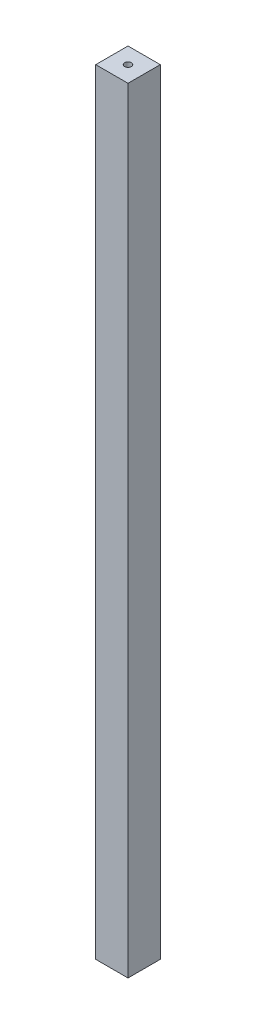
ISO-10303-21;
HEADER;
FILE_DESCRIPTION(('STEP AP214'),'2;1');
FILE_NAME('part.step','',(''),(''),'','','');
FILE_SCHEMA(('AUTOMOTIVE_DESIGN { 1 0 10303 214 1 1 1 1 }'));
ENDSEC;
DATA;
#1=APPLICATION_CONTEXT('core data for automotive mechanical design processes');
#2=APPLICATION_PROTOCOL_DEFINITION('international standard','automotive_design',2000,#1);
#3=PRODUCT_CONTEXT('',#1,'mechanical');
#4=PRODUCT('Part','Part','',(#3));
#5=PRODUCT_RELATED_PRODUCT_CATEGORY('part','',(#4));
#6=PRODUCT_DEFINITION_FORMATION('','',#4);
#7=PRODUCT_DEFINITION_CONTEXT('part definition',#1,'design');
#8=PRODUCT_DEFINITION('design','',#6,#7);
#9=PRODUCT_DEFINITION_SHAPE('','',#8);
#10=(LENGTH_UNIT() NAMED_UNIT(*) SI_UNIT(.MILLI.,.METRE.));
#11=(NAMED_UNIT(*) PLANE_ANGLE_UNIT() SI_UNIT($,.RADIAN.));
#12=(NAMED_UNIT(*) SI_UNIT($,.STERADIAN.) SOLID_ANGLE_UNIT());
#13=UNCERTAINTY_MEASURE_WITH_UNIT(LENGTH_MEASURE(1.E-05),#10,'distance_accuracy_value','');
#14=(GEOMETRIC_REPRESENTATION_CONTEXT(3) GLOBAL_UNCERTAINTY_ASSIGNED_CONTEXT((#13)) GLOBAL_UNIT_ASSIGNED_CONTEXT((#10,
#11,#12)) REPRESENTATION_CONTEXT('',''));
#15=CARTESIAN_POINT('',(0.,0.,0.));
#16=DIRECTION('',(0.,0.,1.));
#17=DIRECTION('',(1.,0.,0.));
#18=AXIS2_PLACEMENT_3D('',#15,#16,#17);
#19=CARTESIAN_POINT('',(0.,-241.,10.));
#20=DIRECTION('',(0.,1.,0.));
#21=DIRECTION('',(0.,0.,1.));
#22=AXIS2_PLACEMENT_3D('',#19,#20,#21);
#23=CYLINDRICAL_SURFACE('',#22,2.1);
#24=CARTESIAN_POINT('',(0.,240.,10.));
#25=DIRECTION('',(0.,1.,0.));
#26=DIRECTION('',(0.,0.,1.));
#27=AXIS2_PLACEMENT_3D('',#24,#25,#26);
#28=CIRCLE('',#27,2.1);
#29=CARTESIAN_POINT('',(0.,240.,12.1));
#30=VERTEX_POINT('',#29);
#31=EDGE_CURVE('E24',#30,#30,#28,.T.);
#32=ORIENTED_EDGE('',*,*,#31,.T.);
#33=EDGE_LOOP('',(#32));
#34=FACE_BOUND('',#33,.T.);
#35=CARTESIAN_POINT('',(0.,-240.,10.));
#36=DIRECTION('',(0.,1.,0.));
#37=DIRECTION('',(0.,0.,1.));
#38=AXIS2_PLACEMENT_3D('',#35,#36,#37);
#39=CIRCLE('',#38,2.1);
#40=CARTESIAN_POINT('',(0.,-240.,12.1));
#41=VERTEX_POINT('',#40);
#42=EDGE_CURVE('E100',#41,#41,#39,.T.);
#43=ORIENTED_EDGE('',*,*,#42,.F.);
#44=EDGE_LOOP('',(#43));
#45=FACE_BOUND('',#44,.T.);
#46=ADVANCED_FACE('F16',(#34,#45),#23,.F.);
#47=CARTESIAN_POINT('',(10.,-240.,0.));
#48=DIRECTION('',(1.,0.,0.));
#49=DIRECTION('',(0.,1.,0.));
#50=AXIS2_PLACEMENT_3D('',#47,#48,#49);
#51=PLANE('',#50);
#52=DIRECTION('',(0.,0.,1.));
#53=VECTOR('',#52,1.);
#54=CARTESIAN_POINT('',(10.,-240.,0.));
#55=LINE('',#54,#53);
#56=CARTESIAN_POINT('',(10.,-240.,0.));
#57=VERTEX_POINT('',#56);
#58=CARTESIAN_POINT('',(10.,-240.,20.));
#59=VERTEX_POINT('',#58);
#60=EDGE_CURVE('E97',#57,#59,#55,.T.);
#61=ORIENTED_EDGE('',*,*,#60,.F.);
#62=DIRECTION('',(0.,1.,0.));
#63=VECTOR('',#62,1.);
#64=CARTESIAN_POINT('',(10.,-240.,0.));
#65=LINE('',#64,#63);
#66=CARTESIAN_POINT('',(10.,240.,0.));
#67=VERTEX_POINT('',#66);
#68=EDGE_CURVE('E10',#57,#67,#65,.T.);
#69=ORIENTED_EDGE('',*,*,#68,.T.);
#70=DIRECTION('',(0.,0.,1.));
#71=VECTOR('',#70,1.);
#72=CARTESIAN_POINT('',(10.,240.,0.));
#73=LINE('',#72,#71);
#74=CARTESIAN_POINT('',(10.,240.,20.));
#75=VERTEX_POINT('',#74);
#76=EDGE_CURVE('E40',#67,#75,#73,.T.);
#77=ORIENTED_EDGE('',*,*,#76,.T.);
#78=DIRECTION('',(0.,1.,0.));
#79=VECTOR('',#78,1.);
#80=CARTESIAN_POINT('',(10.,-240.,20.));
#81=LINE('',#80,#79);
#82=EDGE_CURVE('E73',#59,#75,#81,.T.);
#83=ORIENTED_EDGE('',*,*,#82,.F.);
#84=EDGE_LOOP('',(#61,#69,#77,#83));
#85=FACE_BOUND('',#84,.T.);
#86=ADVANCED_FACE('F136',(#85),#51,.T.);
#87=CARTESIAN_POINT('',(-10.,-240.,0.));
#88=DIRECTION('',(0.,0.,1.));
#89=DIRECTION('',(1.,0.,0.));
#90=AXIS2_PLACEMENT_3D('',#87,#88,#89);
#91=PLANE('',#90);
#92=DIRECTION('',(1.,0.,0.));
#93=VECTOR('',#92,1.);
#94=CARTESIAN_POINT('',(-10.,240.,0.));
#95=LINE('',#94,#93);
#96=CARTESIAN_POINT('',(-10.,240.,0.));
#97=VERTEX_POINT('',#96);
#98=EDGE_CURVE('E76',#97,#67,#95,.T.);
#99=ORIENTED_EDGE('',*,*,#98,.T.);
#100=ORIENTED_EDGE('',*,*,#68,.F.);
#101=DIRECTION('',(1.,0.,0.));
#102=VECTOR('',#101,1.);
#103=CARTESIAN_POINT('',(-10.,-240.,0.));
#104=LINE('',#103,#102);
#105=CARTESIAN_POINT('',(-10.,-240.,0.));
#106=VERTEX_POINT('',#105);
#107=EDGE_CURVE('E111',#106,#57,#104,.T.);
#108=ORIENTED_EDGE('',*,*,#107,.F.);
#109=DIRECTION('',(0.,1.,0.));
#110=VECTOR('',#109,1.);
#111=CARTESIAN_POINT('',(-10.,-240.,0.));
#112=LINE('',#111,#110);
#113=EDGE_CURVE('E86',#106,#97,#112,.T.);
#114=ORIENTED_EDGE('',*,*,#113,.T.);
#115=EDGE_LOOP('',(#99,#100,#108,#114));
#116=FACE_BOUND('',#115,.T.);
#117=ADVANCED_FACE('F127',(#116),#91,.F.);
#118=CARTESIAN_POINT('',(-10.,240.,0.));
#119=DIRECTION('',(0.,1.,0.));
#120=DIRECTION('',(1.,0.,0.));
#121=AXIS2_PLACEMENT_3D('',#118,#119,#120);
#122=PLANE('',#121);
#123=ORIENTED_EDGE('',*,*,#31,.F.);
#124=EDGE_LOOP('',(#123));
#125=FACE_BOUND('',#124,.T.);
#126=ORIENTED_EDGE('',*,*,#98,.F.);
#127=DIRECTION('',(0.,0.,1.));
#128=VECTOR('',#127,1.);
#129=CARTESIAN_POINT('',(-10.,240.,0.));
#130=LINE('',#129,#128);
#131=CARTESIAN_POINT('',(-10.,240.,20.));
#132=VERTEX_POINT('',#131);
#133=EDGE_CURVE('E79',#97,#132,#130,.T.);
#134=ORIENTED_EDGE('',*,*,#133,.T.);
#135=DIRECTION('',(1.,0.,0.));
#136=VECTOR('',#135,1.);
#137=CARTESIAN_POINT('',(-10.,240.,20.));
#138=LINE('',#137,#136);
#139=EDGE_CURVE('E67',#132,#75,#138,.T.);
#140=ORIENTED_EDGE('',*,*,#139,.T.);
#141=ORIENTED_EDGE('',*,*,#76,.F.);
#142=EDGE_LOOP('',(#126,#134,#140,#141));
#143=FACE_BOUND('',#142,.T.);
#144=ADVANCED_FACE('F80',(#125,#143),#122,.T.);
#145=CARTESIAN_POINT('',(-10.,-240.,20.));
#146=DIRECTION('',(0.,0.,1.));
#147=DIRECTION('',(1.,0.,0.));
#148=AXIS2_PLACEMENT_3D('',#145,#146,#147);
#149=PLANE('',#148);
#150=DIRECTION('',(0.,1.,0.));
#151=VECTOR('',#150,1.);
#152=CARTESIAN_POINT('',(-10.,-240.,20.));
#153=LINE('',#152,#151);
#154=CARTESIAN_POINT('',(-10.,-240.,20.));
#155=VERTEX_POINT('',#154);
#156=EDGE_CURVE('E72',#155,#132,#153,.T.);
#157=ORIENTED_EDGE('',*,*,#156,.F.);
#158=DIRECTION('',(1.,0.,0.));
#159=VECTOR('',#158,1.);
#160=CARTESIAN_POINT('',(-10.,-240.,20.));
#161=LINE('',#160,#159);
#162=EDGE_CURVE('E108',#155,#59,#161,.T.);
#163=ORIENTED_EDGE('',*,*,#162,.T.);
#164=ORIENTED_EDGE('',*,*,#82,.T.);
#165=ORIENTED_EDGE('',*,*,#139,.F.);
#166=EDGE_LOOP('',(#157,#163,#164,#165));
#167=FACE_BOUND('',#166,.T.);
#168=ADVANCED_FACE('F69',(#167),#149,.T.);
#169=CARTESIAN_POINT('',(-10.,-240.,0.));
#170=DIRECTION('',(0.,1.,0.));
#171=DIRECTION('',(1.,0.,0.));
#172=AXIS2_PLACEMENT_3D('',#169,#170,#171);
#173=PLANE('',#172);
#174=ORIENTED_EDGE('',*,*,#42,.T.);
#175=EDGE_LOOP('',(#174));
#176=FACE_BOUND('',#175,.T.);
#177=ORIENTED_EDGE('',*,*,#60,.T.);
#178=ORIENTED_EDGE('',*,*,#162,.F.);
#179=DIRECTION('',(0.,0.,1.));
#180=VECTOR('',#179,1.);
#181=CARTESIAN_POINT('',(-10.,-240.,0.));
#182=LINE('',#181,#180);
#183=EDGE_CURVE('E91',#106,#155,#182,.T.);
#184=ORIENTED_EDGE('',*,*,#183,.F.);
#185=ORIENTED_EDGE('',*,*,#107,.T.);
#186=EDGE_LOOP('',(#177,#178,#184,#185));
#187=FACE_BOUND('',#186,.T.);
#188=ADVANCED_FACE('F134',(#176,#187),#173,.F.);
#189=CARTESIAN_POINT('',(-10.,-240.,0.));
#190=DIRECTION('',(1.,0.,0.));
#191=DIRECTION('',(0.,1.,0.));
#192=AXIS2_PLACEMENT_3D('',#189,#190,#191);
#193=PLANE('',#192);
#194=ORIENTED_EDGE('',*,*,#156,.T.);
#195=ORIENTED_EDGE('',*,*,#133,.F.);
#196=ORIENTED_EDGE('',*,*,#113,.F.);
#197=ORIENTED_EDGE('',*,*,#183,.T.);
#198=EDGE_LOOP('',(#194,#195,#196,#197));
#199=FACE_BOUND('',#198,.T.);
#200=ADVANCED_FACE('F89',(#199),#193,.F.);
#201=CLOSED_SHELL('',(#46,#86,#117,#144,#168,#188,#200));
#202=MANIFOLD_SOLID_BREP('B1',#201);
#203=ADVANCED_BREP_SHAPE_REPRESENTATION('',(#18,#202),#14);
#204=SHAPE_DEFINITION_REPRESENTATION(#9,#203);
ENDSEC;
END-ISO-10303-21;
